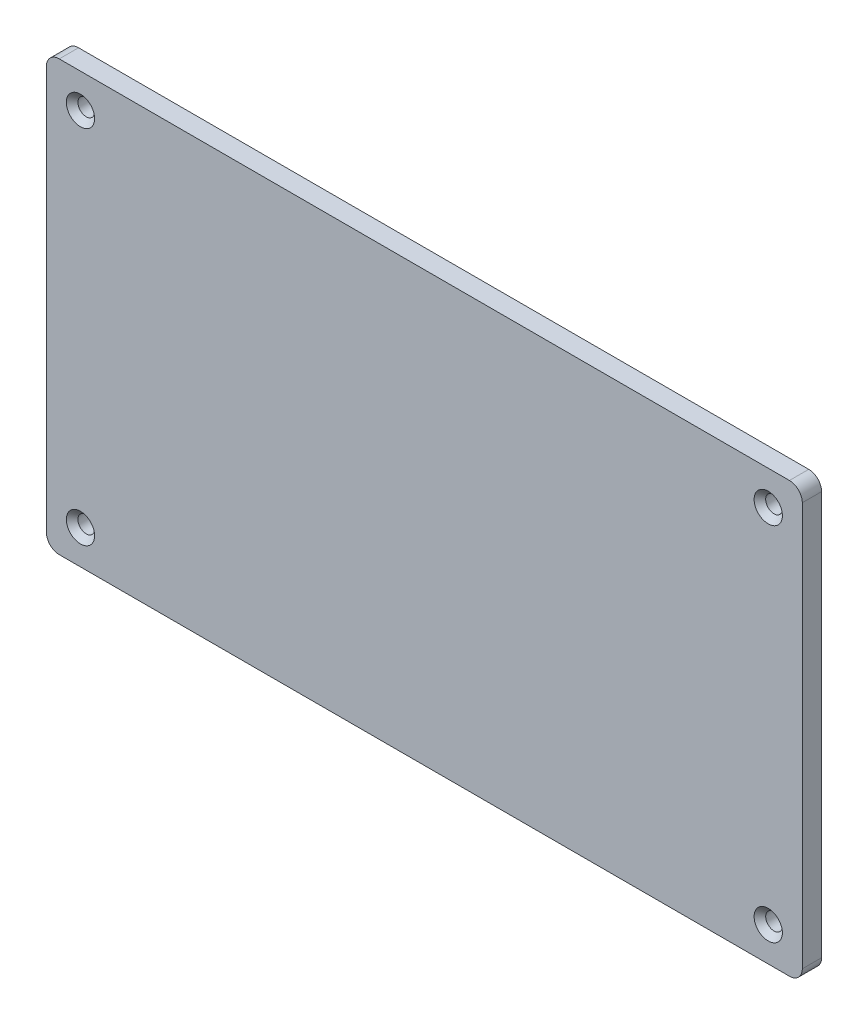
ISO-10303-21;
HEADER;
FILE_DESCRIPTION(('STEP AP214'),'2;1');
FILE_NAME('part.step','',(''),(''),'','','');
FILE_SCHEMA(('AUTOMOTIVE_DESIGN { 1 0 10303 214 1 1 1 1 }'));
ENDSEC;
DATA;
#1=APPLICATION_CONTEXT('core data for automotive mechanical design processes');
#2=APPLICATION_PROTOCOL_DEFINITION('international standard','automotive_design',2000,#1);
#3=PRODUCT_CONTEXT('',#1,'mechanical');
#4=PRODUCT('Part','Part','',(#3));
#5=PRODUCT_RELATED_PRODUCT_CATEGORY('part','',(#4));
#6=PRODUCT_DEFINITION_FORMATION('','',#4);
#7=PRODUCT_DEFINITION_CONTEXT('part definition',#1,'design');
#8=PRODUCT_DEFINITION('design','',#6,#7);
#9=PRODUCT_DEFINITION_SHAPE('','',#8);
#10=(LENGTH_UNIT() NAMED_UNIT(*) SI_UNIT(.MILLI.,.METRE.));
#11=(NAMED_UNIT(*) PLANE_ANGLE_UNIT() SI_UNIT($,.RADIAN.));
#12=(NAMED_UNIT(*) SI_UNIT($,.STERADIAN.) SOLID_ANGLE_UNIT());
#13=UNCERTAINTY_MEASURE_WITH_UNIT(LENGTH_MEASURE(1.E-05),#10,'distance_accuracy_value','');
#14=(GEOMETRIC_REPRESENTATION_CONTEXT(3) GLOBAL_UNCERTAINTY_ASSIGNED_CONTEXT((#13)) GLOBAL_UNIT_ASSIGNED_CONTEXT((#10,
#11,#12)) REPRESENTATION_CONTEXT('',''));
#15=CARTESIAN_POINT('',(0.,0.,0.));
#16=DIRECTION('',(0.,0.,1.));
#17=DIRECTION('',(1.,0.,0.));
#18=AXIS2_PLACEMENT_3D('',#15,#16,#17);
#19=CARTESIAN_POINT('',(0.,0.,3.));
#20=DIRECTION('',(0.,0.,-1.));
#21=DIRECTION('',(-1.,0.,0.));
#22=AXIS2_PLACEMENT_3D('',#19,#20,#21);
#23=PLANE('',#22);
#24=CARTESIAN_POINT('',(-53.5,-28.1,3.));
#25=DIRECTION('',(0.,0.,1.));
#26=DIRECTION('',(1.,0.,0.));
#27=AXIS2_PLACEMENT_3D('',#24,#25,#26);
#28=CIRCLE('',#27,2.2);
#29=CARTESIAN_POINT('',(-51.3,-28.1,3.));
#30=VERTEX_POINT('',#29);
#31=EDGE_CURVE('E197',#30,#30,#28,.T.);
#32=ORIENTED_EDGE('',*,*,#31,.F.);
#33=EDGE_LOOP('',(#32));
#34=FACE_BOUND('',#33,.T.);
#35=CARTESIAN_POINT('',(53.5,-28.1,3.));
#36=DIRECTION('',(0.,0.,1.));
#37=DIRECTION('',(1.,0.,0.));
#38=AXIS2_PLACEMENT_3D('',#35,#36,#37);
#39=CIRCLE('',#38,2.2);
#40=CARTESIAN_POINT('',(55.7,-28.1,3.));
#41=VERTEX_POINT('',#40);
#42=EDGE_CURVE('E188',#41,#41,#39,.T.);
#43=ORIENTED_EDGE('',*,*,#42,.F.);
#44=EDGE_LOOP('',(#43));
#45=FACE_BOUND('',#44,.T.);
#46=DIRECTION('',(0.,-1.,0.));
#47=VECTOR('',#46,1.);
#48=CARTESIAN_POINT('',(-58.8,-33.4,3.));
#49=LINE('',#48,#47);
#50=CARTESIAN_POINT('',(-58.8,31.4,3.));
#51=VERTEX_POINT('',#50);
#52=CARTESIAN_POINT('',(-58.8,-31.4,3.));
#53=VERTEX_POINT('',#52);
#54=EDGE_CURVE('E123',#51,#53,#49,.T.);
#55=ORIENTED_EDGE('',*,*,#54,.T.);
#56=CARTESIAN_POINT('',(-56.8,-31.4,3.));
#57=DIRECTION('',(0.,0.,-1.));
#58=DIRECTION('',(-1.,0.,0.));
#59=AXIS2_PLACEMENT_3D('',#56,#57,#58);
#60=CIRCLE('',#59,2.);
#61=CARTESIAN_POINT('',(-56.8,-33.4,3.));
#62=VERTEX_POINT('',#61);
#63=EDGE_CURVE('E41',#53,#62,#60,.F.);
#64=ORIENTED_EDGE('',*,*,#63,.T.);
#65=DIRECTION('',(1.,0.,0.));
#66=VECTOR('',#65,1.);
#67=CARTESIAN_POINT('',(-58.8,-33.4,3.));
#68=LINE('',#67,#66);
#69=CARTESIAN_POINT('',(56.8,-33.4,3.));
#70=VERTEX_POINT('',#69);
#71=EDGE_CURVE('E120',#62,#70,#68,.T.);
#72=ORIENTED_EDGE('',*,*,#71,.T.);
#73=CARTESIAN_POINT('',(56.8,-31.4,3.));
#74=DIRECTION('',(0.,0.,-1.));
#75=DIRECTION('',(-1.,0.,0.));
#76=AXIS2_PLACEMENT_3D('',#73,#74,#75);
#77=CIRCLE('',#76,2.);
#78=CARTESIAN_POINT('',(58.8,-31.4,3.));
#79=VERTEX_POINT('',#78);
#80=EDGE_CURVE('E144',#70,#79,#77,.F.);
#81=ORIENTED_EDGE('',*,*,#80,.T.);
#82=DIRECTION('',(0.,1.,0.));
#83=VECTOR('',#82,1.);
#84=CARTESIAN_POINT('',(58.8,-33.4,3.));
#85=LINE('',#84,#83);
#86=CARTESIAN_POINT('',(58.8,31.4,3.));
#87=VERTEX_POINT('',#86);
#88=EDGE_CURVE('E166',#79,#87,#85,.T.);
#89=ORIENTED_EDGE('',*,*,#88,.T.);
#90=CARTESIAN_POINT('',(56.8,31.4,3.));
#91=DIRECTION('',(0.,0.,-1.));
#92=DIRECTION('',(-1.,0.,0.));
#93=AXIS2_PLACEMENT_3D('',#90,#91,#92);
#94=CIRCLE('',#93,2.);
#95=CARTESIAN_POINT('',(56.8,33.4,3.));
#96=VERTEX_POINT('',#95);
#97=EDGE_CURVE('E134',#87,#96,#94,.F.);
#98=ORIENTED_EDGE('',*,*,#97,.T.);
#99=DIRECTION('',(-1.,0.,0.));
#100=VECTOR('',#99,1.);
#101=CARTESIAN_POINT('',(-58.8,33.4,3.));
#102=LINE('',#101,#100);
#103=CARTESIAN_POINT('',(-56.8,33.4,3.));
#104=VERTEX_POINT('',#103);
#105=EDGE_CURVE('E169',#96,#104,#102,.T.);
#106=ORIENTED_EDGE('',*,*,#105,.T.);
#107=CARTESIAN_POINT('',(-56.8,31.4,3.));
#108=DIRECTION('',(0.,0.,-1.));
#109=DIRECTION('',(-1.,0.,0.));
#110=AXIS2_PLACEMENT_3D('',#107,#108,#109);
#111=CIRCLE('',#110,2.);
#112=EDGE_CURVE('E115',#104,#51,#111,.F.);
#113=ORIENTED_EDGE('',*,*,#112,.T.);
#114=EDGE_LOOP('',(#55,#64,#72,#81,#89,#98,#106,#113));
#115=FACE_BOUND('',#114,.T.);
#116=CARTESIAN_POINT('',(-53.5,28.1,3.));
#117=DIRECTION('',(0.,0.,1.));
#118=DIRECTION('',(1.,0.,0.));
#119=AXIS2_PLACEMENT_3D('',#116,#117,#118);
#120=CIRCLE('',#119,2.2);
#121=CARTESIAN_POINT('',(-51.3,28.1,3.));
#122=VERTEX_POINT('',#121);
#123=EDGE_CURVE('E206',#122,#122,#120,.T.);
#124=ORIENTED_EDGE('',*,*,#123,.F.);
#125=EDGE_LOOP('',(#124));
#126=FACE_BOUND('',#125,.T.);
#127=CARTESIAN_POINT('',(53.5,28.1,3.));
#128=DIRECTION('',(0.,0.,1.));
#129=DIRECTION('',(1.,0.,0.));
#130=AXIS2_PLACEMENT_3D('',#127,#128,#129);
#131=CIRCLE('',#130,2.2);
#132=CARTESIAN_POINT('',(55.7,28.1,3.));
#133=VERTEX_POINT('',#132);
#134=EDGE_CURVE('E215',#133,#133,#131,.T.);
#135=ORIENTED_EDGE('',*,*,#134,.F.);
#136=EDGE_LOOP('',(#135));
#137=FACE_BOUND('',#136,.T.);
#138=ADVANCED_FACE('F33',(#34,#45,#115,#126,#137),#23,.F.);
#139=CARTESIAN_POINT('',(-56.8,-31.4,3.));
#140=DIRECTION('',(0.,0.,-1.));
#141=DIRECTION('',(-1.,0.,0.));
#142=AXIS2_PLACEMENT_3D('',#139,#140,#141);
#143=CYLINDRICAL_SURFACE('',#142,2.);
#144=DIRECTION('',(0.,0.,-1.));
#145=VECTOR('',#144,1.);
#146=CARTESIAN_POINT('',(-56.8,-33.4,3.));
#147=LINE('',#146,#145);
#148=CARTESIAN_POINT('',(-56.8,-33.4,0.));
#149=VERTEX_POINT('',#148);
#150=EDGE_CURVE('E149',#62,#149,#147,.T.);
#151=ORIENTED_EDGE('',*,*,#150,.F.);
#152=ORIENTED_EDGE('',*,*,#63,.F.);
#153=DIRECTION('',(0.,0.,-1.));
#154=VECTOR('',#153,1.);
#155=CARTESIAN_POINT('',(-58.8,-31.4,3.));
#156=LINE('',#155,#154);
#157=CARTESIAN_POINT('',(-58.8,-31.4,0.));
#158=VERTEX_POINT('',#157);
#159=EDGE_CURVE('E152',#158,#53,#156,.F.);
#160=ORIENTED_EDGE('',*,*,#159,.F.);
#161=CARTESIAN_POINT('',(-56.8,-31.4,0.));
#162=DIRECTION('',(0.,0.,-1.));
#163=DIRECTION('',(-1.,0.,0.));
#164=AXIS2_PLACEMENT_3D('',#161,#162,#163);
#165=CIRCLE('',#164,2.);
#166=EDGE_CURVE('E11',#149,#158,#165,.T.);
#167=ORIENTED_EDGE('',*,*,#166,.F.);
#168=EDGE_LOOP('',(#151,#152,#160,#167));
#169=FACE_BOUND('',#168,.T.);
#170=ADVANCED_FACE('F35',(#169),#143,.T.);
#171=CARTESIAN_POINT('',(56.8,-31.4,3.));
#172=DIRECTION('',(0.,0.,-1.));
#173=DIRECTION('',(-1.,0.,0.));
#174=AXIS2_PLACEMENT_3D('',#171,#172,#173);
#175=CYLINDRICAL_SURFACE('',#174,2.);
#176=DIRECTION('',(0.,0.,-1.));
#177=VECTOR('',#176,1.);
#178=CARTESIAN_POINT('',(58.8,-31.4,3.));
#179=LINE('',#178,#177);
#180=CARTESIAN_POINT('',(58.8,-31.4,0.));
#181=VERTEX_POINT('',#180);
#182=EDGE_CURVE('E138',#79,#181,#179,.T.);
#183=ORIENTED_EDGE('',*,*,#182,.F.);
#184=ORIENTED_EDGE('',*,*,#80,.F.);
#185=DIRECTION('',(0.,0.,-1.));
#186=VECTOR('',#185,1.);
#187=CARTESIAN_POINT('',(56.8,-33.4,3.));
#188=LINE('',#187,#186);
#189=CARTESIAN_POINT('',(56.8,-33.4,0.));
#190=VERTEX_POINT('',#189);
#191=EDGE_CURVE('E141',#190,#70,#188,.F.);
#192=ORIENTED_EDGE('',*,*,#191,.F.);
#193=CARTESIAN_POINT('',(56.8,-31.4,0.));
#194=DIRECTION('',(0.,0.,-1.));
#195=DIRECTION('',(-1.,0.,0.));
#196=AXIS2_PLACEMENT_3D('',#193,#194,#195);
#197=CIRCLE('',#196,2.);
#198=EDGE_CURVE('E146',#181,#190,#197,.T.);
#199=ORIENTED_EDGE('',*,*,#198,.F.);
#200=EDGE_LOOP('',(#183,#184,#192,#199));
#201=FACE_BOUND('',#200,.T.);
#202=ADVANCED_FACE('F164',(#201),#175,.T.);
#203=CARTESIAN_POINT('',(56.8,31.4,3.));
#204=DIRECTION('',(0.,0.,-1.));
#205=DIRECTION('',(-1.,0.,0.));
#206=AXIS2_PLACEMENT_3D('',#203,#204,#205);
#207=CYLINDRICAL_SURFACE('',#206,2.);
#208=DIRECTION('',(0.,0.,-1.));
#209=VECTOR('',#208,1.);
#210=CARTESIAN_POINT('',(56.8,33.4,3.));
#211=LINE('',#210,#209);
#212=CARTESIAN_POINT('',(56.8,33.4,0.));
#213=VERTEX_POINT('',#212);
#214=EDGE_CURVE('E104',#96,#213,#211,.T.);
#215=ORIENTED_EDGE('',*,*,#214,.F.);
#216=ORIENTED_EDGE('',*,*,#97,.F.);
#217=DIRECTION('',(0.,0.,-1.));
#218=VECTOR('',#217,1.);
#219=CARTESIAN_POINT('',(58.8,31.4,3.));
#220=LINE('',#219,#218);
#221=CARTESIAN_POINT('',(58.8,31.4,0.));
#222=VERTEX_POINT('',#221);
#223=EDGE_CURVE('E131',#222,#87,#220,.F.);
#224=ORIENTED_EDGE('',*,*,#223,.F.);
#225=CARTESIAN_POINT('',(56.8,31.4,0.));
#226=DIRECTION('',(0.,0.,-1.));
#227=DIRECTION('',(-1.,0.,0.));
#228=AXIS2_PLACEMENT_3D('',#225,#226,#227);
#229=CIRCLE('',#228,2.);
#230=EDGE_CURVE('E136',#213,#222,#229,.T.);
#231=ORIENTED_EDGE('',*,*,#230,.F.);
#232=EDGE_LOOP('',(#215,#216,#224,#231));
#233=FACE_BOUND('',#232,.T.);
#234=ADVANCED_FACE('F173',(#233),#207,.T.);
#235=CARTESIAN_POINT('',(-56.8,31.4,3.));
#236=DIRECTION('',(0.,0.,1.));
#237=DIRECTION('',(1.,0.,0.));
#238=AXIS2_PLACEMENT_3D('',#235,#236,#237);
#239=CYLINDRICAL_SURFACE('',#238,2.);
#240=DIRECTION('',(0.,0.,1.));
#241=VECTOR('',#240,1.);
#242=CARTESIAN_POINT('',(-56.8,33.4,3.));
#243=LINE('',#242,#241);
#244=CARTESIAN_POINT('',(-56.8,33.4,0.));
#245=VERTEX_POINT('',#244);
#246=EDGE_CURVE('E102',#245,#104,#243,.T.);
#247=ORIENTED_EDGE('',*,*,#246,.F.);
#248=CARTESIAN_POINT('',(-56.8,31.4,0.));
#249=DIRECTION('',(0.,0.,-1.));
#250=DIRECTION('',(-1.,0.,0.));
#251=AXIS2_PLACEMENT_3D('',#248,#249,#250);
#252=CIRCLE('',#251,2.);
#253=CARTESIAN_POINT('',(-58.8,31.4,0.));
#254=VERTEX_POINT('',#253);
#255=EDGE_CURVE('E109',#254,#245,#252,.T.);
#256=ORIENTED_EDGE('',*,*,#255,.F.);
#257=DIRECTION('',(0.,0.,1.));
#258=VECTOR('',#257,1.);
#259=CARTESIAN_POINT('',(-58.8,31.4,3.));
#260=LINE('',#259,#258);
#261=EDGE_CURVE('E116',#51,#254,#260,.F.);
#262=ORIENTED_EDGE('',*,*,#261,.F.);
#263=ORIENTED_EDGE('',*,*,#112,.F.);
#264=EDGE_LOOP('',(#247,#256,#262,#263));
#265=FACE_BOUND('',#264,.T.);
#266=ADVANCED_FACE('F119',(#265),#239,.T.);
#267=CARTESIAN_POINT('',(58.8,-33.4,3.));
#268=DIRECTION('',(-1.,0.,0.));
#269=DIRECTION('',(0.,0.,1.));
#270=AXIS2_PLACEMENT_3D('',#267,#268,#269);
#271=PLANE('',#270);
#272=ORIENTED_EDGE('',*,*,#88,.F.);
#273=ORIENTED_EDGE('',*,*,#182,.T.);
#274=DIRECTION('',(0.,1.,0.));
#275=VECTOR('',#274,1.);
#276=CARTESIAN_POINT('',(58.8,-33.4,0.));
#277=LINE('',#276,#275);
#278=EDGE_CURVE('E107',#181,#222,#277,.T.);
#279=ORIENTED_EDGE('',*,*,#278,.T.);
#280=ORIENTED_EDGE('',*,*,#223,.T.);
#281=EDGE_LOOP('',(#272,#273,#279,#280));
#282=FACE_BOUND('',#281,.T.);
#283=ADVANCED_FACE('F174',(#282),#271,.F.);
#284=CARTESIAN_POINT('',(-58.8,33.4,3.));
#285=DIRECTION('',(0.,-1.,0.));
#286=DIRECTION('',(0.,0.,-1.));
#287=AXIS2_PLACEMENT_3D('',#284,#285,#286);
#288=PLANE('',#287);
#289=ORIENTED_EDGE('',*,*,#105,.F.);
#290=ORIENTED_EDGE('',*,*,#214,.T.);
#291=DIRECTION('',(-1.,0.,0.));
#292=VECTOR('',#291,1.);
#293=CARTESIAN_POINT('',(-58.8,33.4,0.));
#294=LINE('',#293,#292);
#295=EDGE_CURVE('E97',#213,#245,#294,.T.);
#296=ORIENTED_EDGE('',*,*,#295,.T.);
#297=ORIENTED_EDGE('',*,*,#246,.T.);
#298=EDGE_LOOP('',(#289,#290,#296,#297));
#299=FACE_BOUND('',#298,.T.);
#300=ADVANCED_FACE('F100',(#299),#288,.F.);
#301=CARTESIAN_POINT('',(-58.8,-33.4,3.));
#302=DIRECTION('',(1.,0.,0.));
#303=DIRECTION('',(0.,0.,-1.));
#304=AXIS2_PLACEMENT_3D('',#301,#302,#303);
#305=PLANE('',#304);
#306=DIRECTION('',(0.,-1.,0.));
#307=VECTOR('',#306,1.);
#308=CARTESIAN_POINT('',(-58.8,-33.4,0.));
#309=LINE('',#308,#307);
#310=EDGE_CURVE('E106',#254,#158,#309,.T.);
#311=ORIENTED_EDGE('',*,*,#310,.T.);
#312=ORIENTED_EDGE('',*,*,#159,.T.);
#313=ORIENTED_EDGE('',*,*,#54,.F.);
#314=ORIENTED_EDGE('',*,*,#261,.T.);
#315=EDGE_LOOP('',(#311,#312,#313,#314));
#316=FACE_BOUND('',#315,.T.);
#317=ADVANCED_FACE('F183',(#316),#305,.F.);
#318=CARTESIAN_POINT('',(-58.8,-33.4,3.));
#319=DIRECTION('',(0.,1.,0.));
#320=DIRECTION('',(0.,0.,1.));
#321=AXIS2_PLACEMENT_3D('',#318,#319,#320);
#322=PLANE('',#321);
#323=ORIENTED_EDGE('',*,*,#71,.F.);
#324=ORIENTED_EDGE('',*,*,#150,.T.);
#325=DIRECTION('',(1.,0.,0.));
#326=VECTOR('',#325,1.);
#327=CARTESIAN_POINT('',(-58.8,-33.4,0.));
#328=LINE('',#327,#326);
#329=EDGE_CURVE('E126',#149,#190,#328,.T.);
#330=ORIENTED_EDGE('',*,*,#329,.T.);
#331=ORIENTED_EDGE('',*,*,#191,.T.);
#332=EDGE_LOOP('',(#323,#324,#330,#331));
#333=FACE_BOUND('',#332,.T.);
#334=ADVANCED_FACE('F160',(#333),#322,.F.);
#335=CARTESIAN_POINT('',(0.,0.,0.));
#336=DIRECTION('',(0.,0.,-1.));
#337=DIRECTION('',(-1.,0.,0.));
#338=AXIS2_PLACEMENT_3D('',#335,#336,#337);
#339=PLANE('',#338);
#340=CARTESIAN_POINT('',(53.5,28.1,0.));
#341=DIRECTION('',(0.,0.,-1.));
#342=DIRECTION('',(-1.,0.,0.));
#343=AXIS2_PLACEMENT_3D('',#340,#341,#342);
#344=CIRCLE('',#343,1.3);
#345=CARTESIAN_POINT('',(52.2,28.1,0.));
#346=VERTEX_POINT('',#345);
#347=EDGE_CURVE('E209',#346,#346,#344,.T.);
#348=ORIENTED_EDGE('',*,*,#347,.F.);
#349=EDGE_LOOP('',(#348));
#350=FACE_BOUND('',#349,.T.);
#351=CARTESIAN_POINT('',(-53.5,28.1,0.));
#352=DIRECTION('',(0.,0.,-1.));
#353=DIRECTION('',(-1.,0.,0.));
#354=AXIS2_PLACEMENT_3D('',#351,#352,#353);
#355=CIRCLE('',#354,1.3);
#356=CARTESIAN_POINT('',(-54.8,28.1,0.));
#357=VERTEX_POINT('',#356);
#358=EDGE_CURVE('E200',#357,#357,#355,.T.);
#359=ORIENTED_EDGE('',*,*,#358,.F.);
#360=EDGE_LOOP('',(#359));
#361=FACE_BOUND('',#360,.T.);
#362=CARTESIAN_POINT('',(-53.5,-28.1,0.));
#363=DIRECTION('',(0.,0.,-1.));
#364=DIRECTION('',(-1.,0.,0.));
#365=AXIS2_PLACEMENT_3D('',#362,#363,#364);
#366=CIRCLE('',#365,1.3);
#367=CARTESIAN_POINT('',(-54.8,-28.1,0.));
#368=VERTEX_POINT('',#367);
#369=EDGE_CURVE('E191',#368,#368,#366,.T.);
#370=ORIENTED_EDGE('',*,*,#369,.F.);
#371=EDGE_LOOP('',(#370));
#372=FACE_BOUND('',#371,.T.);
#373=CARTESIAN_POINT('',(53.5,-28.1,0.));
#374=DIRECTION('',(0.,0.,-1.));
#375=DIRECTION('',(-1.,0.,0.));
#376=AXIS2_PLACEMENT_3D('',#373,#374,#375);
#377=CIRCLE('',#376,1.3);
#378=CARTESIAN_POINT('',(52.2,-28.1,0.));
#379=VERTEX_POINT('',#378);
#380=EDGE_CURVE('E176',#379,#379,#377,.T.);
#381=ORIENTED_EDGE('',*,*,#380,.F.);
#382=EDGE_LOOP('',(#381));
#383=FACE_BOUND('',#382,.T.);
#384=ORIENTED_EDGE('',*,*,#329,.F.);
#385=ORIENTED_EDGE('',*,*,#166,.T.);
#386=ORIENTED_EDGE('',*,*,#310,.F.);
#387=ORIENTED_EDGE('',*,*,#255,.T.);
#388=ORIENTED_EDGE('',*,*,#295,.F.);
#389=ORIENTED_EDGE('',*,*,#230,.T.);
#390=ORIENTED_EDGE('',*,*,#278,.F.);
#391=ORIENTED_EDGE('',*,*,#198,.T.);
#392=EDGE_LOOP('',(#384,#385,#386,#387,#388,#389,#390,#391));
#393=FACE_BOUND('',#392,.T.);
#394=ADVANCED_FACE('F110',(#350,#361,#372,#383,#393),#339,.T.);
#395=CARTESIAN_POINT('',(53.5,-28.1,3.));
#396=DIRECTION('',(0.,0.,1.));
#397=DIRECTION('',(1.,0.,0.));
#398=AXIS2_PLACEMENT_3D('',#395,#396,#397);
#399=CYLINDRICAL_SURFACE('',#398,1.3);
#400=CARTESIAN_POINT('',(53.5,-28.1,2.1));
#401=DIRECTION('',(0.,0.,1.));
#402=DIRECTION('',(1.,0.,0.));
#403=AXIS2_PLACEMENT_3D('',#400,#401,#402);
#404=CIRCLE('',#403,1.3);
#405=CARTESIAN_POINT('',(54.8,-28.1,2.1));
#406=VERTEX_POINT('',#405);
#407=EDGE_CURVE('E179',#406,#406,#404,.T.);
#408=ORIENTED_EDGE('',*,*,#407,.T.);
#409=EDGE_LOOP('',(#408));
#410=FACE_BOUND('',#409,.T.);
#411=ORIENTED_EDGE('',*,*,#380,.T.);
#412=EDGE_LOOP('',(#411));
#413=FACE_BOUND('',#412,.T.);
#414=ADVANCED_FACE('F233',(#410,#413),#399,.F.);
#415=CARTESIAN_POINT('',(53.5,-28.1,3.));
#416=DIRECTION('',(0.,0.,1.));
#417=DIRECTION('',(1.,0.,0.));
#418=AXIS2_PLACEMENT_3D('',#415,#416,#417);
#419=CONICAL_SURFACE('',#418,2.2,0.785398163397449);
#420=ORIENTED_EDGE('',*,*,#407,.F.);
#421=EDGE_LOOP('',(#420));
#422=FACE_BOUND('',#421,.T.);
#423=ORIENTED_EDGE('',*,*,#42,.T.);
#424=EDGE_LOOP('',(#423));
#425=FACE_BOUND('',#424,.T.);
#426=ADVANCED_FACE('F294',(#422,#425),#419,.F.);
#427=CARTESIAN_POINT('',(-53.5,-28.1,3.));
#428=DIRECTION('',(0.,0.,1.));
#429=DIRECTION('',(1.,0.,0.));
#430=AXIS2_PLACEMENT_3D('',#427,#428,#429);
#431=CYLINDRICAL_SURFACE('',#430,1.3);
#432=CARTESIAN_POINT('',(-53.5,-28.1,2.1));
#433=DIRECTION('',(0.,0.,1.));
#434=DIRECTION('',(1.,0.,0.));
#435=AXIS2_PLACEMENT_3D('',#432,#433,#434);
#436=CIRCLE('',#435,1.3);
#437=CARTESIAN_POINT('',(-52.2,-28.1,2.1));
#438=VERTEX_POINT('',#437);
#439=EDGE_CURVE('E194',#438,#438,#436,.T.);
#440=ORIENTED_EDGE('',*,*,#439,.T.);
#441=EDGE_LOOP('',(#440));
#442=FACE_BOUND('',#441,.T.);
#443=ORIENTED_EDGE('',*,*,#369,.T.);
#444=EDGE_LOOP('',(#443));
#445=FACE_BOUND('',#444,.T.);
#446=ADVANCED_FACE('F300',(#442,#445),#431,.F.);
#447=CARTESIAN_POINT('',(-53.5,-28.1,3.));
#448=DIRECTION('',(0.,0.,1.));
#449=DIRECTION('',(1.,0.,0.));
#450=AXIS2_PLACEMENT_3D('',#447,#448,#449);
#451=CONICAL_SURFACE('',#450,2.2,0.785398163397449);
#452=ORIENTED_EDGE('',*,*,#439,.F.);
#453=EDGE_LOOP('',(#452));
#454=FACE_BOUND('',#453,.T.);
#455=ORIENTED_EDGE('',*,*,#31,.T.);
#456=EDGE_LOOP('',(#455));
#457=FACE_BOUND('',#456,.T.);
#458=ADVANCED_FACE('F307',(#454,#457),#451,.F.);
#459=CARTESIAN_POINT('',(-53.5,28.1,3.));
#460=DIRECTION('',(0.,0.,1.));
#461=DIRECTION('',(1.,0.,0.));
#462=AXIS2_PLACEMENT_3D('',#459,#460,#461);
#463=CYLINDRICAL_SURFACE('',#462,1.3);
#464=CARTESIAN_POINT('',(-53.5,28.1,2.1));
#465=DIRECTION('',(0.,0.,1.));
#466=DIRECTION('',(1.,0.,0.));
#467=AXIS2_PLACEMENT_3D('',#464,#465,#466);
#468=CIRCLE('',#467,1.3);
#469=CARTESIAN_POINT('',(-52.2,28.1,2.1));
#470=VERTEX_POINT('',#469);
#471=EDGE_CURVE('E203',#470,#470,#468,.T.);
#472=ORIENTED_EDGE('',*,*,#471,.T.);
#473=EDGE_LOOP('',(#472));
#474=FACE_BOUND('',#473,.T.);
#475=ORIENTED_EDGE('',*,*,#358,.T.);
#476=EDGE_LOOP('',(#475));
#477=FACE_BOUND('',#476,.T.);
#478=ADVANCED_FACE('F315',(#474,#477),#463,.F.);
#479=CARTESIAN_POINT('',(-53.5,28.1,3.));
#480=DIRECTION('',(0.,0.,1.));
#481=DIRECTION('',(1.,0.,0.));
#482=AXIS2_PLACEMENT_3D('',#479,#480,#481);
#483=CONICAL_SURFACE('',#482,2.2,0.785398163397449);
#484=ORIENTED_EDGE('',*,*,#471,.F.);
#485=EDGE_LOOP('',(#484));
#486=FACE_BOUND('',#485,.T.);
#487=ORIENTED_EDGE('',*,*,#123,.T.);
#488=EDGE_LOOP('',(#487));
#489=FACE_BOUND('',#488,.T.);
#490=ADVANCED_FACE('F323',(#486,#489),#483,.F.);
#491=CARTESIAN_POINT('',(53.5,28.1,3.));
#492=DIRECTION('',(0.,0.,1.));
#493=DIRECTION('',(1.,0.,0.));
#494=AXIS2_PLACEMENT_3D('',#491,#492,#493);
#495=CYLINDRICAL_SURFACE('',#494,1.3);
#496=CARTESIAN_POINT('',(53.5,28.1,2.1));
#497=DIRECTION('',(0.,0.,1.));
#498=DIRECTION('',(1.,0.,0.));
#499=AXIS2_PLACEMENT_3D('',#496,#497,#498);
#500=CIRCLE('',#499,1.3);
#501=CARTESIAN_POINT('',(54.8,28.1,2.1));
#502=VERTEX_POINT('',#501);
#503=EDGE_CURVE('E212',#502,#502,#500,.T.);
#504=ORIENTED_EDGE('',*,*,#503,.T.);
#505=EDGE_LOOP('',(#504));
#506=FACE_BOUND('',#505,.T.);
#507=ORIENTED_EDGE('',*,*,#347,.T.);
#508=EDGE_LOOP('',(#507));
#509=FACE_BOUND('',#508,.T.);
#510=ADVANCED_FACE('F331',(#506,#509),#495,.F.);
#511=CARTESIAN_POINT('',(53.5,28.1,3.));
#512=DIRECTION('',(0.,0.,1.));
#513=DIRECTION('',(1.,0.,0.));
#514=AXIS2_PLACEMENT_3D('',#511,#512,#513);
#515=CONICAL_SURFACE('',#514,2.2,0.785398163397449);
#516=ORIENTED_EDGE('',*,*,#503,.F.);
#517=EDGE_LOOP('',(#516));
#518=FACE_BOUND('',#517,.T.);
#519=ORIENTED_EDGE('',*,*,#134,.T.);
#520=EDGE_LOOP('',(#519));
#521=FACE_BOUND('',#520,.T.);
#522=ADVANCED_FACE('F219',(#518,#521),#515,.F.);
#523=CLOSED_SHELL('',(#138,#170,#202,#234,#266,#283,#300,#317,#334,#394,#414,#426,#446,#458,
#478,#490,#510,#522));
#524=MANIFOLD_SOLID_BREP('B2',#523);
#525=ADVANCED_BREP_SHAPE_REPRESENTATION('',(#18,#524),#14);
#526=SHAPE_DEFINITION_REPRESENTATION(#9,#525);
ENDSEC;
END-ISO-10303-21;
